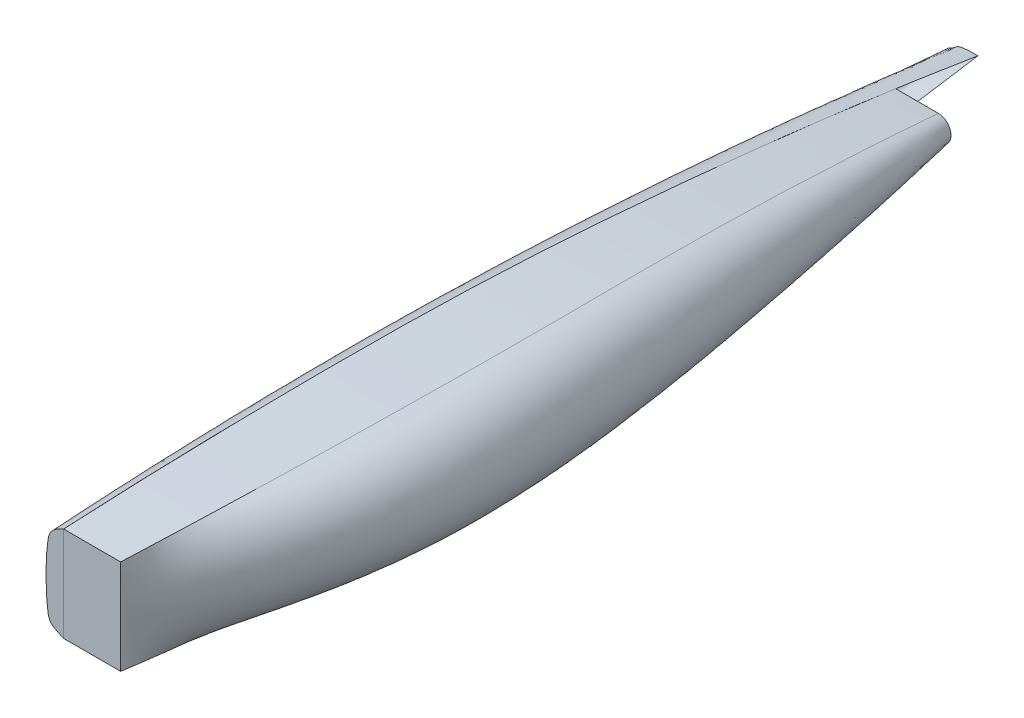
ISO-10303-21;
HEADER;
FILE_DESCRIPTION(('STEP AP214'),'2;1');
FILE_NAME('part.step','',(''),(''),'','','');
FILE_SCHEMA(('AUTOMOTIVE_DESIGN { 1 0 10303 214 1 1 1 1 }'));
ENDSEC;
DATA;
#1=APPLICATION_CONTEXT('core data for automotive mechanical design processes');
#2=APPLICATION_PROTOCOL_DEFINITION('international standard','automotive_design',2000,#1);
#3=PRODUCT_CONTEXT('',#1,'mechanical');
#4=PRODUCT('Part','Part','',(#3));
#5=PRODUCT_RELATED_PRODUCT_CATEGORY('part','',(#4));
#6=PRODUCT_DEFINITION_FORMATION('','',#4);
#7=PRODUCT_DEFINITION_CONTEXT('part definition',#1,'design');
#8=PRODUCT_DEFINITION('design','',#6,#7);
#9=PRODUCT_DEFINITION_SHAPE('','',#8);
#10=(LENGTH_UNIT() NAMED_UNIT(*) SI_UNIT(.MILLI.,.METRE.));
#11=(NAMED_UNIT(*) PLANE_ANGLE_UNIT() SI_UNIT($,.RADIAN.));
#12=(NAMED_UNIT(*) SI_UNIT($,.STERADIAN.) SOLID_ANGLE_UNIT());
#13=UNCERTAINTY_MEASURE_WITH_UNIT(LENGTH_MEASURE(1.E-05),#10,'distance_accuracy_value','');
#14=(GEOMETRIC_REPRESENTATION_CONTEXT(3) GLOBAL_UNCERTAINTY_ASSIGNED_CONTEXT((#13)) GLOBAL_UNIT_ASSIGNED_CONTEXT((#10,
#11,#12)) REPRESENTATION_CONTEXT('',''));
#15=CARTESIAN_POINT('',(0.,0.,0.));
#16=DIRECTION('',(0.,0.,1.));
#17=DIRECTION('',(1.,0.,0.));
#18=AXIS2_PLACEMENT_3D('',#15,#16,#17);
#19=CARTESIAN_POINT('',(1027.92532465034,10497.7473217622,-20718.));
#20=DIRECTION('',(0.,0.,-1.));
#21=DIRECTION('',(-1.,0.,0.));
#22=AXIS2_PLACEMENT_3D('',#19,#20,#21);
#23=PLANE('',#22);
#24=DIRECTION('',(-1.,0.,0.));
#25=VECTOR('',#24,1.);
#26=CARTESIAN_POINT('',(0.,10803.2966765298,-20718.));
#27=LINE('',#26,#25);
#28=CARTESIAN_POINT('',(1027.92532465034,10803.2966765298,-20718.));
#29=VERTEX_POINT('',#28);
#30=CARTESIAN_POINT('',(0.,10803.2966765298,-20718.));
#31=VERTEX_POINT('',#30);
#32=EDGE_CURVE('E252',#29,#31,#27,.T.);
#33=ORIENTED_EDGE('',*,*,#32,.F.);
#34=CARTESIAN_POINT('',(1027.92532465034,10497.7473217622,-20718.));
#35=DIRECTION('',(0.,0.,1.));
#36=DIRECTION('',(-1.,0.,0.));
#37=AXIS2_PLACEMENT_3D('',#34,#35,#36);
#38=CIRCLE('',#37,305.549354767676);
#39=CARTESIAN_POINT('',(1333.47467941801,10497.7473217622,-20718.));
#40=VERTEX_POINT('',#39);
#41=EDGE_CURVE('E369',#40,#29,#38,.T.);
#42=ORIENTED_EDGE('',*,*,#41,.F.);
#43=CARTESIAN_POINT('',(1027.92532465034,10497.7473217622,-20718.));
#44=DIRECTION('',(0.,0.,1.));
#45=DIRECTION('',(1.,0.,0.));
#46=AXIS2_PLACEMENT_3D('',#43,#44,#45);
#47=CIRCLE('',#46,305.549354767676);
#48=CARTESIAN_POINT('',(1027.92532465034,10192.1979669945,-20718.));
#49=VERTEX_POINT('',#48);
#50=EDGE_CURVE('E322',#49,#40,#47,.T.);
#51=ORIENTED_EDGE('',*,*,#50,.F.);
#52=DIRECTION('',(1.,0.,0.));
#53=VECTOR('',#52,1.);
#54=CARTESIAN_POINT('',(1027.92532465034,10192.1979669945,-20718.));
#55=LINE('',#54,#53);
#56=CARTESIAN_POINT('',(0.,10192.1979669945,-20718.));
#57=VERTEX_POINT('',#56);
#58=EDGE_CURVE('E188',#57,#49,#55,.T.);
#59=ORIENTED_EDGE('',*,*,#58,.F.);
#60=DIRECTION('',(0.,-1.,0.));
#61=VECTOR('',#60,1.);
#62=CARTESIAN_POINT('',(0.,10803.2966765298,-20718.));
#63=LINE('',#62,#61);
#64=EDGE_CURVE('E14',#31,#57,#63,.T.);
#65=ORIENTED_EDGE('',*,*,#64,.F.);
#66=EDGE_LOOP('',(#33,#42,#51,#59,#65));
#67=FACE_BOUND('',#66,.T.);
#68=ADVANCED_FACE('F178',(#67),#23,.T.);
#69=CARTESIAN_POINT('',(0.,0.,-678.));
#70=DIRECTION('',(0.,0.,1.));
#71=DIRECTION('',(1.,0.,0.));
#72=AXIS2_PLACEMENT_3D('',#69,#70,#71);
#73=PLANE('',#72);
#74=DIRECTION('',(0.,-1.,0.));
#75=VECTOR('',#74,1.);
#76=CARTESIAN_POINT('',(0.,11639.1820232636,-678.));
#77=LINE('',#76,#75);
#78=CARTESIAN_POINT('',(0.,11639.1820232636,-678.));
#79=VERTEX_POINT('',#78);
#80=CARTESIAN_POINT('',(0.,9356.31262026066,-678.));
#81=VERTEX_POINT('',#80);
#82=EDGE_CURVE('E231',#79,#81,#77,.T.);
#83=ORIENTED_EDGE('',*,*,#82,.T.);
#84=DIRECTION('',(1.,0.,0.));
#85=VECTOR('',#84,1.);
#86=CARTESIAN_POINT('',(0.,9356.31262026066,-678.));
#87=LINE('',#86,#85);
#88=CARTESIAN_POINT('',(1374.83399170481,9356.31262026066,-678.));
#89=VERTEX_POINT('',#88);
#90=EDGE_CURVE('E247',#81,#89,#87,.T.);
#91=ORIENTED_EDGE('',*,*,#90,.T.);
#92=DIRECTION('',(0.,1.,0.));
#93=VECTOR('',#92,1.);
#94=CARTESIAN_POINT('',(1374.83399170481,11639.1820232636,-678.));
#95=LINE('',#94,#93);
#96=CARTESIAN_POINT('',(1374.83399170481,11639.1820232636,-678.));
#97=VERTEX_POINT('',#96);
#98=EDGE_CURVE('E233',#89,#97,#95,.T.);
#99=ORIENTED_EDGE('',*,*,#98,.T.);
#100=DIRECTION('',(-1.,0.,0.));
#101=VECTOR('',#100,1.);
#102=CARTESIAN_POINT('',(0.,11639.1820232636,-678.));
#103=LINE('',#102,#101);
#104=EDGE_CURVE('E226',#97,#79,#103,.T.);
#105=ORIENTED_EDGE('',*,*,#104,.T.);
#106=EDGE_LOOP('',(#83,#91,#99,#105));
#107=FACE_BOUND('',#106,.T.);
#108=ADVANCED_FACE('F229',(#107),#73,.T.);
#109=CARTESIAN_POINT('',(0.,11639.1820232636,-678.));
#110=CARTESIAN_POINT('',(0.,11725.5833342849,-2347.63572045033));
#111=CARTESIAN_POINT('',(0.,11822.034521585,-5648.06900664716));
#112=CARTESIAN_POINT('',(0.,11805.1593895931,-10716.2585665588));
#113=CARTESIAN_POINT('',(0.,11427.4796522117,-15717.5077349829));
#114=CARTESIAN_POINT('',(0.,11040.0066002117,-19051.7296863642));
#115=CARTESIAN_POINT('',(0.,10803.2966765298,-20718.));
#116=CARTESIAN_POINT('',(458.277997234937,11639.1820232636,-678.));
#117=CARTESIAN_POINT('',(511.474520662672,11725.5773457812,-2347.07117194521));
#118=CARTESIAN_POINT('',(579.887470947677,11822.0372946347,-5648.32752959555));
#119=CARTESIAN_POINT('',(590.119579513416,11805.1585547831,-10716.189901836));
#120=CARTESIAN_POINT('',(446.93579945534,11427.4802228301,-15717.5239746352));
#121=CARTESIAN_POINT('',(379.987121435317,11040.0058256561,-19051.7379237504));
#122=CARTESIAN_POINT('',(342.641774883445,10803.2966765298,-20718.));
#123=CARTESIAN_POINT('',(916.555994469874,11639.1820232636,-678.));
#124=CARTESIAN_POINT('',(1022.94904132534,11725.5713572775,-2346.50662344009));
#125=CARTESIAN_POINT('',(1159.77494189535,11822.0400676845,-5648.58605254394));
#126=CARTESIAN_POINT('',(1180.23915902683,11805.1577199731,-10716.1212371132));
#127=CARTESIAN_POINT('',(893.871598910681,11427.4807934486,-15717.5402142875));
#128=CARTESIAN_POINT('',(759.974242870633,11040.0050511005,-19051.7461611366));
#129=CARTESIAN_POINT('',(685.283549766891,10803.2966765298,-20718.));
#130=CARTESIAN_POINT('',(1374.83399170481,11639.1820232636,-678.));
#131=CARTESIAN_POINT('',(1534.42356198802,11725.5653687738,-2345.94207493497));
#132=CARTESIAN_POINT('',(1739.66241284303,11822.0428407342,-5648.84457549232));
#133=CARTESIAN_POINT('',(1770.35873854025,11805.1568851631,-10716.0525723904));
#134=CARTESIAN_POINT('',(1340.80739836602,11427.481364067,-15717.5564539398));
#135=CARTESIAN_POINT('',(1139.96136430595,11040.004276545,-19051.7543985228));
#136=CARTESIAN_POINT('',(1027.92532465034,10803.2966765298,-20718.));
#137=B_SPLINE_SURFACE_WITH_KNOTS('',3,3,((#109,#110,#111,#112,#113,#114,#115),(#116,#117,#118,
#119,#120,#121,#122),(#123,#124,#125,#126,#127,#128,#129),(#130,#131,#132,#133,#134,#135,#136)),
.UNSPECIFIED.,.F.,.F.,.F.,(4,4),(4,1,1,1,4),(0.,1.),(0.,0.251370794558403,0.499752521575732,
0.749308130658367,1.),.UNSPECIFIED.);
#138=CARTESIAN_POINT('',(1374.83399170481,11639.1820232636,-678.));
#139=CARTESIAN_POINT('',(1534.42356198802,11725.5653687738,-2345.94207493497));
#140=CARTESIAN_POINT('',(1739.66241284303,11822.0428407342,-5648.84457549232));
#141=CARTESIAN_POINT('',(1770.35873854025,11805.1568851631,-10716.0525723904));
#142=CARTESIAN_POINT('',(1340.80739836602,11427.481364067,-15717.5564539398));
#143=CARTESIAN_POINT('',(1139.96136430595,11040.004276545,-19051.7543985228));
#144=CARTESIAN_POINT('',(1027.92532465034,10803.2966765298,-20718.));
#145=B_SPLINE_CURVE_WITH_KNOTS('',3,(#138,#139,#140,#141,#142,#143,#144),.UNSPECIFIED.,.F.,.F.,
(4,1,1,1,4),(0.,0.251370794558403,0.499752521575732,0.749308130658367,1.),.UNSPECIFIED.);
#146=EDGE_CURVE('E254',#97,#29,#145,.T.);
#147=CARTESIAN_POINT('',(0.,11639.1820232636,-678.));
#148=CARTESIAN_POINT('',(0.,11725.5833342849,-2347.63572045033));
#149=CARTESIAN_POINT('',(0.,11822.034521585,-5648.06900664716));
#150=CARTESIAN_POINT('',(0.,11805.1593895931,-10716.2585665588));
#151=CARTESIAN_POINT('',(0.,11427.4796522117,-15717.5077349829));
#152=CARTESIAN_POINT('',(0.,11040.0066002117,-19051.7296863642));
#153=CARTESIAN_POINT('',(0.,10803.2966765298,-20718.));
#154=B_SPLINE_CURVE_WITH_KNOTS('',3,(#147,#148,#149,#150,#151,#152,#153),.UNSPECIFIED.,.F.,.F.,
(4,1,1,1,4),(0.,0.251370794558403,0.499752521575732,0.749308130658367,1.),.UNSPECIFIED.);
#155=EDGE_CURVE('E239',#31,#79,#154,.F.);
#156=ORIENTED_EDGE('',*,*,#104,.F.);
#157=ORIENTED_EDGE('',*,*,#146,.T.);
#158=ORIENTED_EDGE('',*,*,#32,.T.);
#159=ORIENTED_EDGE('',*,*,#155,.T.);
#160=EDGE_LOOP('',(#156,#157,#158,#159));
#161=FACE_BOUND('',#160,.T.);
#162=ADVANCED_FACE('F251',(#161),#137,.T.);
#163=CARTESIAN_POINT('',(1374.83399170481,11639.1820232636,-678.));
#164=CARTESIAN_POINT('',(1534.42356198802,11725.5653687738,-2345.94207493497));
#165=CARTESIAN_POINT('',(1739.66241284303,11822.0428407342,-5648.84457549232));
#166=CARTESIAN_POINT('',(1770.35873854025,11805.1568851631,-10716.0525723904));
#167=CARTESIAN_POINT('',(1340.80739836602,11427.481364067,-15717.5564539398));
#168=CARTESIAN_POINT('',(1139.96136430595,11040.004276545,-19051.7543985228));
#169=CARTESIAN_POINT('',(1027.92532465034,10803.2966765298,-20718.));
#170=CARTESIAN_POINT('',(1374.83399170481,11615.4198370557,-678.));
#171=CARTESIAN_POINT('',(1555.5063651766,11712.9275193634,-2345.31174432586));
#172=CARTESIAN_POINT('',(1790.64743054619,11827.4297537224,-5649.13107025804));
#173=CARTESIAN_POINT('',(1811.94334086078,11805.0058499545,-10715.9833568065));
#174=CARTESIAN_POINT('',(1371.55461667482,11427.6777892624,-15717.5467043676));
#175=CARTESIAN_POINT('',(1157.57161316445,11039.645717867,-19051.8239239357));
#176=CARTESIAN_POINT('',(1037.91695982661,10803.2966765298,-20718.));
#177=CARTESIAN_POINT('',(1374.83399170481,11567.9047933216,-678.));
#178=CARTESIAN_POINT('',(1597.67197155377,11687.6611492243,-2344.05108310764));
#179=CARTESIAN_POINT('',(1892.61810621583,11832.1767823288,-5649.70405978951));
#180=CARTESIAN_POINT('',(1895.24738817716,11800.8912903668,-10715.8449256388));
#181=CARTESIAN_POINT('',(1432.98921637071,11424.6563186328,-15717.5272052231));
#182=CARTESIAN_POINT('',(1192.79482775057,11037.945495917,-19051.9629747615));
#183=CARTESIAN_POINT('',(1057.90294704829,10802.3135719356,-20718.));
#184=CARTESIAN_POINT('',(1374.83399170481,11496.6567011027,-678.));
#185=CARTESIAN_POINT('',(1660.20644914958,11641.805299732,-2341.47017133821));
#186=CARTESIAN_POINT('',(2044.11394505894,11825.0401262841,-5650.88009865321));
#187=CARTESIAN_POINT('',(2019.34136547102,11781.9739066164,-10715.551217298));
#188=CARTESIAN_POINT('',(1524.13793136101,11411.5239303809,-15717.525842205));
#189=CARTESIAN_POINT('',(1245.04837826904,11029.6770944891,-19052.1642220255));
#190=CARTESIAN_POINT('',(1087.60128739703,10797.9151281667,-20718.));
#191=CARTESIAN_POINT('',(1374.83399170481,11425.4295696028,-678.000000000001));
#192=CARTESIAN_POINT('',(1721.415277615,11590.22489081,-2338.52352610452));
#193=CARTESIAN_POINT('',(2192.64845315799,11802.8449889206,-5652.22405328567));
#194=CARTESIAN_POINT('',(2141.34188286766,11750.819543001,-10715.2115162796));
#195=CARTESIAN_POINT('',(1613.41505769227,11389.5183860502,-15717.5406485065));
#196=CARTESIAN_POINT('',(1296.25037937464,11016.517952416,-19052.358583389));
#197=CARTESIAN_POINT('',(1116.73019617085,10790.6184244253,-20718.));
#198=CARTESIAN_POINT('',(1374.83399170481,11354.2198861591,-678.000000000001));
#199=CARTESIAN_POINT('',(1780.6805596614,11532.5004331451,-2335.2652009241));
#200=CARTESIAN_POINT('',(2336.75604124993,11766.2168303943,-5653.71121446798));
#201=CARTESIAN_POINT('',(2260.03374764263,11707.6057863438,-10714.832246592));
#202=CARTESIAN_POINT('',(1699.98470208179,11358.9771058378,-15717.5706320868));
#203=CARTESIAN_POINT('',(1345.91300799056,10998.4022703377,-19052.5440522966));
#204=CARTESIAN_POINT('',(1145.01105194866,10780.5067590778,-20718.));
#205=CARTESIAN_POINT('',(1374.83399170481,11283.0241381085,-678.));
#206=CARTESIAN_POINT('',(1837.41552397056,11469.0059361791,-2331.82046853739));
#207=CARTESIAN_POINT('',(2475.00662065364,11715.5857885833,-5655.28417781567));
#208=CARTESIAN_POINT('',(2374.23727251961,11652.7497303439,-10714.4287778391));
#209=CARTESIAN_POINT('',(1783.03483623601,11320.1789223829,-15717.6116917435));
#210=CARTESIAN_POINT('',(1393.56748168005,10975.5519358669,-19052.7198776411));
#211=CARTESIAN_POINT('',(1172.16523330936,10767.6634304906,-20718.));
#212=CARTESIAN_POINT('',(1374.83399170481,11211.8388416028,-678.));
#213=CARTESIAN_POINT('',(1891.06215668368,11399.9811326077,-2328.29184767801));
#214=CARTESIAN_POINT('',(2606.02508853474,11651.615100777,-5656.89599606479));
#215=CARTESIAN_POINT('',(2482.81867232475,11586.7520663104,-10714.0135825862));
#216=CARTESIAN_POINT('',(1861.78521815859,11273.5106354442,-15717.660865538));
#217=CARTESIAN_POINT('',(1438.76750768037,10948.1772664776,-19052.8845915014));
#218=CARTESIAN_POINT('',(1197.93580592775,10752.2244753757,-20718.));
#219=CARTESIAN_POINT('',(1374.83399170481,11140.6605127936,-677.999999999999));
#220=CARTESIAN_POINT('',(1941.09863680321,11325.7749471399,-2324.78204382135));
#221=CARTESIAN_POINT('',(2728.50558898105,11575.0803543461,-5658.49960686901));
#222=CARTESIAN_POINT('',(2584.70000701957,11510.2305497593,-10713.5992584874));
#223=CARTESIAN_POINT('',(1935.49862656835,11219.4270079878,-15717.7148030253));
#224=CARTESIAN_POINT('',(1481.08380488751,10916.5361098938,-19053.0375522281));
#225=CARTESIAN_POINT('',(1222.0658354786,10734.3259304454,-20718.));
#226=CARTESIAN_POINT('',(1374.83399170481,11069.4856678327,-677.999999999999));
#227=CARTESIAN_POINT('',(1987.04338479132,11246.7743011999,-2321.38586081325));
#228=CARTESIAN_POINT('',(2841.22572051731,11486.8919389192,-5660.05159419004));
#229=CARTESIAN_POINT('',(2678.87120459727,11423.9055214271,-10713.1973454507));
#230=CARTESIAN_POINT('',(2003.48094715833,11158.4479786439,-15717.7707429088));
#231=CARTESIAN_POINT('',(1520.12206268116,10880.9331424137,-19053.1774505195));
#232=CARTESIAN_POINT('',(1244.3302389509,10714.1522360627,-20718.));
#233=CARTESIAN_POINT('',(1374.83399170481,10998.3108228718,-677.999999999999));
#234=CARTESIAN_POINT('',(2028.45924723225,11163.4168745887,-2318.19071922851));
#235=CARTESIAN_POINT('',(2943.06063282342,11388.0786645123,-5661.51189705526));
#236=CARTESIAN_POINT('',(2764.39764234037,11328.592980438,-10712.8185752103));
#237=CARTESIAN_POINT('',(2065.09526594969,11091.1614581385,-15717.8258000724));
#238=CARTESIAN_POINT('',(1555.5094546309,10841.6999205558,-19053.3038122553));
#239=CARTESIAN_POINT('',(1264.50393333363,10691.8878325904,-20718.));
#240=CARTESIAN_POINT('',(1374.83399170481,10927.1324940626,-678.));
#241=CARTESIAN_POINT('',(2064.95685212416,11076.1809651207,-2315.27515920387));
#242=CARTESIAN_POINT('',(3032.99483910447,11279.7785982552,-5662.8445507058));
#243=CARTESIAN_POINT('',(2840.43142305215,11225.1983125715,-10712.4724968817));
#244=CARTESIAN_POINT('',(2119.75860126827,11018.2090926881,-15717.8777284926));
#245=CARTESIAN_POINT('',(1586.91737543965,10799.2115335827,-19053.4154628005));
#246=CARTESIAN_POINT('',(1282.40247826389,10667.7578030396,-20717.9999999999));
#247=CARTESIAN_POINT('',(1374.83399170481,10855.9471975568,-678.));
#248=CARTESIAN_POINT('',(2096.1975797994,10985.5811838496,-2312.70813695908));
#249=CARTESIAN_POINT('',(3110.13436566145,11163.2273371652,-5664.01795318928));
#250=CARTESIAN_POINT('',(2906.21691566348,11114.7053009613,-10712.1675837417));
#251=CARTESIAN_POINT('',(2166.95715498021,10940.2892793104,-15717.9242216531));
#252=CARTESIAN_POINT('',(1614.04296687618,10753.8643243641,-19053.5120947625));
#253=CARTESIAN_POINT('',(1297.84143337877,10641.9872304212,-20718.));
#254=CARTESIAN_POINT('',(1374.83399170481,10784.7514495063,-678.));
#255=CARTESIAN_POINT('',(2121.89560743488,10892.1626488499,-2310.54838140521));
#256=CARTESIAN_POINT('',(3173.71571935787,11039.7443715354,-5665.00521808625));
#257=CARTESIAN_POINT('',(2961.1007093333,10998.1686394919,-10711.9109538062));
#258=CARTESIAN_POINT('',(2206.23995710547,10858.1430753177,-15717.9636838987));
#259=CARTESIAN_POINT('',(1636.63543590475,10706.0893560267,-19053.5926484268));
#260=CARTESIAN_POINT('',(1310.68476196604,10614.8330490605,-20718.));
#261=CARTESIAN_POINT('',(1374.83399170481,10713.5417660625,-678.));
#262=CARTESIAN_POINT('',(2141.82061836382,10796.4945507034,-2308.8438381757));
#263=CARTESIAN_POINT('',(3223.11524906046,10910.7197382683,-5665.78437135567));
#264=CARTESIAN_POINT('',(3004.53515750063,10876.7017982484,-10711.7085021651));
#265=CARTESIAN_POINT('',(2237.23493184485,10772.5544811161,-15717.9944981209));
#266=CARTESIAN_POINT('',(1654.47308006722,10656.3337112549,-19053.6569390026));
#267=CARTESIAN_POINT('',(1320.79642731349,10586.5521932827,-20718.));
#268=CARTESIAN_POINT('',(1374.83399170481,10642.3146345627,-678.));
#269=CARTESIAN_POINT('',(2155.79611098434,10699.1672201778,-2307.6316316041));
#270=CARTESIAN_POINT('',(3257.85547420781,10777.5974093699,-5666.33842393505));
#271=CARTESIAN_POINT('',(3036.08605619724,10751.4681999409,-10711.5647052658));
#272=CARTESIAN_POINT('',(2259.63964850897,10684.3376120662,-15718.0157419857));
#273=CARTESIAN_POINT('',(1667.39196466383,10605.06898509,-19053.7041098203));
#274=CARTESIAN_POINT('',(1328.09313105484,10557.4232845088,-20718.));
#275=CARTESIAN_POINT('',(1374.83399170481,10571.0665423437,-678.));
#276=CARTESIAN_POINT('',(2163.71103878589,10600.7756862247,-2306.93675971091));
#277=CARTESIAN_POINT('',(3277.60787009853,10641.8646470388,-5666.65592468513));
#278=CARTESIAN_POINT('',(3055.43552591962,10623.6672862932,-10711.4826168173));
#279=CARTESIAN_POINT('',(2273.2385312031,10594.3347499461,-15718.0266467899));
#280=CARTESIAN_POINT('',(1675.25772200082,10552.7762607025,-19053.7339034885));
#281=CARTESIAN_POINT('',(1332.49157482377,10527.7249441601,-20718.));
#282=CARTESIAN_POINT('',(1374.83399170481,10523.5514986096,-678.));
#283=CARTESIAN_POINT('',(2164.89106688402,10534.8943161025,-2306.82952741294));
#284=CARTESIAN_POINT('',(3280.67557300233,10550.6334386625,-5666.70478658267));
#285=CARTESIAN_POINT('',(3060.06734386239,10537.5753392411,-10711.4704152379));
#286=CARTESIAN_POINT('',(2276.33703694174,10533.7131896834,-15718.0265846194));
#287=CARTESIAN_POINT('',(1677.09001975028,10517.5606823981,-19053.7422769408));
#288=CARTESIAN_POINT('',(1333.47467941801,10507.7389569384,-20718.));
#289=CARTESIAN_POINT('',(1374.83399170481,10475.9917193804,-678.));
#290=CARTESIAN_POINT('',(2164.53832457373,10468.9897033437,-2306.86432257757));
#291=CARTESIAN_POINT('',(3279.83015687046,10459.4734843724,-5666.68849257141));
#292=CARTESIAN_POINT('',(3059.67084667444,10451.3875739791,-10711.4758948283));
#293=CARTESIAN_POINT('',(2276.66400384383,10473.0279529258,-15718.020914871));
#294=CARTESIAN_POINT('',(1677.25310652157,10482.3044751162,-19053.7518713776));
#295=CARTESIAN_POINT('',(1333.47467941801,10487.7407985634,-20718.));
#296=CARTESIAN_POINT('',(1374.83399170481,10428.3872334506,-678.));
#297=CARTESIAN_POINT('',(2162.6482414301,10403.0619815714,-2307.04156869852));
#298=CARTESIAN_POINT('',(3275.18928865264,10368.2486511975,-5666.60684837192));
#299=CARTESIAN_POINT('',(3054.32968149873,10365.1962429609,-10711.4991083074));
#300=CARTESIAN_POINT('',(2274.18258785295,10412.2526095904,-15718.0096208338));
#301=CARTESIAN_POINT('',(1675.74208588698,10447.0078276285,-19053.7626904191));
#302=CARTESIAN_POINT('',(1332.48872494526,10467.7307088005,-20718.));
#303=CARTESIAN_POINT('',(1374.83399170481,10356.9560779648,-678.));
#304=CARTESIAN_POINT('',(2153.86531632334,10304.7406544002,-2307.82188341661));
#305=CARTESIAN_POINT('',(3253.42924763214,10232.9084013399,-5666.24943258456));
#306=CARTESIAN_POINT('',(3034.1754432792,10237.2596709348,-10711.5943184531));
#307=CARTESIAN_POINT('',(2261.38470865872,10321.8674955031,-15717.986043241));
#308=CARTESIAN_POINT('',(1668.27819235623,10394.5247288733,-19053.7537525284));
#309=CARTESIAN_POINT('',(1328.08168744358,10438.0115660437,-20718.));
#310=CARTESIAN_POINT('',(1374.83399170481,10285.5039689585,-678.));
#311=CARTESIAN_POINT('',(2139.19613505478,10207.5813846978,-2309.10247656965));
#312=CARTESIAN_POINT('',(3217.11157432563,10100.4563390352,-5665.66351336307));
#313=CARTESIAN_POINT('',(3002.06265721968,10111.8607225407,-10711.7483389947));
#314=CARTESIAN_POINT('',(2239.6275050308,10233.1526534566,-15717.9556992944));
#315=CARTESIAN_POINT('',(1655.68528013344,10343.0186524377,-19053.7210175692));
#316=CARTESIAN_POINT('',(1320.77630177508,10408.8755371587,-20718.));
#317=CARTESIAN_POINT('',(1374.83399170481,10214.0343795022,-678.));
#318=CARTESIAN_POINT('',(2118.77964286028,10112.1343162459,-2310.85573361262));
#319=CARTESIAN_POINT('',(3166.59368644769,9972.26785917303,-5664.86176801204));
#320=CARTESIAN_POINT('',(2958.29349388467,9990.15839336817,-10711.9577010903));
#321=CARTESIAN_POINT('',(2209.11200959566,10146.9892975625,-15717.9197955749));
#322=CARTESIAN_POINT('',(1638.08748495354,10292.9892969621,-19053.6639965144));
#323=CARTESIAN_POINT('',(1310.65830395917,10380.5983743024,-20717.9999999999));
#324=CARTESIAN_POINT('',(1374.83399170481,10142.5507826665,-678.));
#325=CARTESIAN_POINT('',(2092.79427533251,10018.9435812016,-2313.04446007752));
#326=CARTESIAN_POINT('',(3102.36601060267,9849.67221495099,-5663.86121408628));
#327=CARTESIAN_POINT('',(2903.28085282506,9873.27870196437,-10712.2179323103));
#328=CARTESIAN_POINT('',(2170.13276597318,10064.2318585231,-15717.8792094693));
#329=CARTESIAN_POINT('',(1615.64748967727,10244.9275785838,-19053.5836486775));
#330=CARTESIAN_POINT('',(1297.81343001527,10353.4558296317,-20718.));
#331=CARTESIAN_POINT('',(1374.83399170481,10071.0566802962,-678.));
#332=CARTESIAN_POINT('',(2061.46683137475,9928.53270316375,-2315.62112493707));
#333=CARTESIAN_POINT('',(3025.0403735565,9733.94624535447,-5662.68362992937));
#334=CARTESIAN_POINT('',(2837.54757484213,9762.30095156074,-10712.5232082051));
#335=CARTESIAN_POINT('',(2123.06303417552,9985.70448565833,-15717.8354705207));
#336=CARTESIAN_POINT('',(1588.58774691196,10199.2996693495,-19053.4803164608));
#337=CARTESIAN_POINT('',(1282.37822691317,10327.7017388384,-20718.0000000001));
#338=CARTESIAN_POINT('',(1374.83399170481,9999.55557423611,-678.));
#339=CARTESIAN_POINT('',(2025.06894993432,9841.40338623894,-2318.52841104384));
#340=CARTESIAN_POINT('',(2935.3468503159,9626.30175124174,-5661.35524127345));
#341=CARTESIAN_POINT('',(2761.7187305882,9658.24912251768,-10712.8666316338));
#342=CARTESIAN_POINT('',(2068.36279759699,9912.1866992483,-15717.7899497691));
#343=CARTESIAN_POINT('',(1557.16425286909,10156.5548497843,-19053.3554371199));
#344=CARTESIAN_POINT('',(1264.48924162266,10303.5899376142,-20718.));
#345=CARTESIAN_POINT('',(1374.83399170481,9928.05096633118,-678.));
#346=CARTESIAN_POINT('',(1983.91644805528,9758.03078017828,-2321.6995506805));
#347=CARTESIAN_POINT('',(2834.12532884579,9527.87604641181,-5659.90662605989));
#348=CARTESIAN_POINT('',(2676.51844227665,9562.07993815694,-10713.2400710988));
#349=CARTESIAN_POINT('',(2006.56271498433,9844.41210147774,-15717.7446078627));
#350=CARTESIAN_POINT('',(1521.68793833535,10117.1063524726,-19053.2098982627));
#351=CARTESIAN_POINT('',(1244.32967022422,10281.3429761882,-20717.9999999999));
#352=CARTESIAN_POINT('',(1374.83399170481,9856.54635842626,-678.));
#353=CARTESIAN_POINT('',(1938.36771372871,9678.85924325617,-2325.05890390512));
#354=CARTESIAN_POINT('',(2722.31879155993,9439.72184409167,-5658.37239349918));
#355=CARTESIAN_POINT('',(2582.76030774481,9474.67550280989,-10713.6344253259));
#356=CARTESIAN_POINT('',(1938.26928120503,9783.05312198045,-15717.7012515006));
#357=CARTESIAN_POINT('',(1482.49896996859,10081.3438690724,-19053.0456022815));
#358=CARTESIAN_POINT('',(1222.08270879831,10261.1834047898,-20718.));
#359=CARTESIAN_POINT('',(1374.83399170481,9785.0452523662,-678.));
#360=CARTESIAN_POINT('',(1888.82186441545,9604.29942520697,-2328.52251902384));
#361=CARTESIAN_POINT('',(2600.96385913356,9362.79865287604,-5656.79098201495));
#362=CARTESIAN_POINT('',(2481.34208209199,9396.83253522317,-10714.0395023859));
#363=CARTESIAN_POINT('',(1864.1489155086,9728.72257335715,-15717.662224806));
#364=CARTESIAN_POINT('',(1439.98407122785,10049.6113263609,-19052.8639273343));
#365=CARTESIAN_POINT('',(1197.97090757412,10243.2944194993,-20718.0000000001));
#366=CARTESIAN_POINT('',(1374.83399170481,9713.55114999587,-678.));
#367=CARTESIAN_POINT('',(1835.71684061838,9534.71947961438,-2331.99945779491));
#368=CARTESIAN_POINT('',(2471.1820713515,9297.96621609538,-5655.20399967217));
#369=CARTESIAN_POINT('',(2373.23477096256,9329.25618166849,-10714.4443634212));
#370=CARTESIAN_POINT('',(1784.92980201724,9681.95875333328,-15717.6296880425));
#371=CARTESIAN_POINT('',(1394.55379126025,10022.2223438194,-19052.6671862001));
#372=CARTESIAN_POINT('',(1172.21681678082,10227.8592163972,-20718.));
#373=CARTESIAN_POINT('',(1374.83399170481,9642.06755316014,-678.));
#374=CARTESIAN_POINT('',(1779.52603509125,9470.45836238011,-2335.39112946452));
#375=CARTESIAN_POINT('',(2334.16965166205,9245.9703467429,-5653.65658209859));
#376=CARTESIAN_POINT('',(2259.47523749167,9272.55330409567,-10714.8370582904));
#377=CARTESIAN_POINT('',(1701.38654408611,9643.22703245917,-15717.6063229719));
#378=CARTESIAN_POINT('',(1346.65530310061,9999.44089940219,-19052.4571512334));
#379=CARTESIAN_POINT('',(1145.07427211013,10215.0143424533,-20718.));
#380=CARTESIAN_POINT('',(1374.83399170481,9570.59796370387,-678.));
#381=CARTESIAN_POINT('',(1720.75843303245,9411.75710685938,-2338.59901589109));
#382=CARTESIAN_POINT('',(2191.18610179261,9207.46613289852,-5652.19380158924));
#383=CARTESIAN_POINT('',(2141.15467940281,9227.21821931298,-10715.2057498359));
#384=CARTESIAN_POINT('',(1614.33887434621,9612.91710039719,-15717.5944194809));
#385=CARTESIAN_POINT('',(1296.75302377237,9981.47894800938,-19052.2364371252));
#386=CARTESIAN_POINT('',(1116.79710925379,10204.8963446374,-20718.));
#387=CARTESIAN_POINT('',(1374.83399170481,9499.14585469759,-678.));
#388=CARTESIAN_POINT('',(1659.94353731705,9358.99635057983,-2341.50208733917));
#389=CARTESIAN_POINT('',(2043.54810534301,9182.90070587845,-5650.87107058217));
#390=CARTESIAN_POINT('',(2019.40827220688,9193.66587679632,-10715.5357540157));
#391=CARTESIAN_POINT('',(1524.63755883371,9591.30161854356,-15717.5973223931));
#392=CARTESIAN_POINT('',(1245.337091936,9968.55821688394,-19052.0071055851));
#393=CARTESIAN_POINT('',(1087.66108036876,10197.5909589689,-20718.));
#394=CARTESIAN_POINT('',(1374.83399170481,9427.71469921181,-678.));
#395=CARTESIAN_POINT('',(1597.67070723936,9311.79253887342,-2344.04839349478));
#396=CARTESIAN_POINT('',(1892.59882714644,9172.93130739127,-5649.71210307587));
#397=CARTESIAN_POINT('',(1895.40770715871,9172.07813346017,-10715.8210137835));
#398=CARTESIAN_POINT('',(1433.15996995465,9578.70553629914,-15717.6155472587));
#399=CARTESIAN_POINT('',(1192.9053912071,9960.60292217507,-19051.772032573));
#400=CARTESIAN_POINT('',(1057.94193761204,10193.1839214672,-20718.));
#401=CARTESIAN_POINT('',(1374.83399170481,9380.11021328198,-678.));
#402=CARTESIAN_POINT('',(1555.5055073281,9285.49996029393,-2345.29715317246));
#403=CARTESIAN_POINT('',(1790.71288073863,9175.53844039376,-5649.14528914859));
#404=CARTESIAN_POINT('',(1812.02415625465,9166.00386039537,-10715.9554852464));
#405=CARTESIAN_POINT('',(1371.58548958371,9576.12058462689,-15717.64479035));
#406=CARTESIAN_POINT('',(1157.62016351949,9959.16615417609,-19051.6128128451));
#407=CARTESIAN_POINT('',(1037.93184784909,10192.1979669945,-20718.));
#408=CARTESIAN_POINT('',(1374.83399170481,9356.31262026066,-678.));
#409=CARTESIAN_POINT('',(1534.42290737246,9272.35832094777,-2345.9215330113));
#410=CARTESIAN_POINT('',(1739.66218840214,9179.79088788089,-5648.86188218494));
#411=CARTESIAN_POINT('',(1770.36047394811,9164.83329025006,-10716.0227209779));
#412=CARTESIAN_POINT('',(1340.80062454656,9576.55351040013,-15717.6594118956));
#413=CARTESIAN_POINT('',(1139.9760713584,9958.94074741299,-19051.5332029812));
#414=CARTESIAN_POINT('',(1027.92532465034,10192.1979669945,-20718.));
#415=B_SPLINE_SURFACE_WITH_KNOTS('',3,3,((#163,#164,#165,#166,#167,#168,#169),(#170,#171,#172,
#173,#174,#175,#176),(#177,#178,#179,#180,#181,#182,#183),(#184,#185,#186,#187,#188,#189,#190),
(#191,#192,#193,#194,#195,#196,#197),(#198,#199,#200,#201,#202,#203,#204),(#205,#206,#207,#208,
#209,#210,#211),(#212,#213,#214,#215,#216,#217,#218),(#219,#220,#221,#222,#223,#224,#225),(#226,
#227,#228,#229,#230,#231,#232),(#233,#234,#235,#236,#237,#238,#239),(#240,#241,#242,#243,#244,
#245,#246),(#247,#248,#249,#250,#251,#252,#253),(#254,#255,#256,#257,#258,#259,#260),(#261,#262,
#263,#264,#265,#266,#267),(#268,#269,#270,#271,#272,#273,#274),(#275,#276,#277,#278,#279,#280,
#281),(#282,#283,#284,#285,#286,#287,#288),(#289,#290,#291,#292,#293,#294,#295),(#296,#297,#298,
#299,#300,#301,#302),(#303,#304,#305,#306,#307,#308,#309),(#310,#311,#312,#313,#314,#315,#316),
(#317,#318,#319,#320,#321,#322,#323),(#324,#325,#326,#327,#328,#329,#330),(#331,#332,#333,#334,
#335,#336,#337),(#338,#339,#340,#341,#342,#343,#344),(#345,#346,#347,#348,#349,#350,#351),(#352,
#353,#354,#355,#356,#357,#358),(#359,#360,#361,#362,#363,#364,#365),(#366,#367,#368,#369,#370,
#371,#372),(#373,#374,#375,#376,#377,#378,#379),(#380,#381,#382,#383,#384,#385,#386),(#387,#388,
#389,#390,#391,#392,#393),(#394,#395,#396,#397,#398,#399,#400),(#401,#402,#403,#404,#405,#406,
#407),(#408,#409,#410,#411,#412,#413,#414)),.UNSPECIFIED.,.F.,.F.,.F.,(4,1,1,1,1,1,1,1,1,1,1,1,
1,1,1,1,2,1,1,1,1,1,1,1,1,1,1,1,1,1,1,1,4),(4,1,1,1,4),(0.,0.0312267353226366,
0.0624534706452732,0.0936802059679098,0.124906941290546,0.156133676613183,0.18736041193582,
0.218587147258456,0.249813882581093,0.281040617903729,0.312267353226366,0.343494088549002,
0.374720823871639,0.405947559194276,0.437174294516912,0.468401029839549,0.499627765162185,
0.530901029839549,0.562174294516912,0.593447559194276,0.624720823871639,0.655994088549002,
0.687267353226366,0.718540617903729,0.749813882581093,0.781087147258456,0.812360411935819,
0.843633676613183,0.874906941290546,0.90618020596791,0.937453470645273,0.968726735322637,1.),
(0.,0.251370794558403,0.499752521575732,0.749308130658367,1.),.UNSPECIFIED.);
#416=CARTESIAN_POINT('',(1374.83399170481,9356.31262026066,-678.));
#417=CARTESIAN_POINT('',(1534.42290737246,9272.35832094777,-2345.9215330113));
#418=CARTESIAN_POINT('',(1739.66218840214,9179.79088788089,-5648.86188218494));
#419=CARTESIAN_POINT('',(1770.36047394811,9164.83329025006,-10716.0227209779));
#420=CARTESIAN_POINT('',(1340.80062454656,9576.55351040013,-15717.6594118956));
#421=CARTESIAN_POINT('',(1139.9760713584,9958.94074741299,-19051.5332029812));
#422=CARTESIAN_POINT('',(1027.92532465034,10192.1979669945,-20718.));
#423=B_SPLINE_CURVE_WITH_KNOTS('',3,(#416,#417,#418,#419,#420,#421,#422),.UNSPECIFIED.,.F.,.F.,
(4,1,1,1,4),(0.,0.251370794558403,0.499752521575732,0.749308130658367,1.),.UNSPECIFIED.);
#424=EDGE_CURVE('E256',#89,#49,#423,.T.);
#425=ORIENTED_EDGE('',*,*,#98,.F.);
#426=ORIENTED_EDGE('',*,*,#424,.T.);
#427=ORIENTED_EDGE('',*,*,#50,.T.);
#428=ORIENTED_EDGE('',*,*,#41,.T.);
#429=ORIENTED_EDGE('',*,*,#146,.F.);
#430=EDGE_LOOP('',(#425,#426,#427,#428,#429));
#431=FACE_BOUND('',#430,.T.);
#432=ADVANCED_FACE('F286',(#431),#415,.T.);
#433=CARTESIAN_POINT('',(0.,9356.31262026066,-678.));
#434=DIRECTION('',(-1.,0.,0.));
#435=DIRECTION('',(0.,1.,0.));
#436=AXIS2_PLACEMENT_3D('',#433,#434,#435);
#437=PLANE('',#436);
#438=ORIENTED_EDGE('',*,*,#82,.F.);
#439=ORIENTED_EDGE('',*,*,#155,.F.);
#440=ORIENTED_EDGE('',*,*,#64,.T.);
#441=CARTESIAN_POINT('',(0.,9356.31262026066,-678.));
#442=CARTESIAN_POINT('',(0.,9272.33789620447,-2347.6151019107));
#443=CARTESIAN_POINT('',(0.,9179.80033902018,-5648.08638278545));
#444=CARTESIAN_POINT('',(0.,9164.83046649866,-10716.2285868555));
#445=CARTESIAN_POINT('',(0.,9576.55536863459,-15717.6111403902));
#446=CARTESIAN_POINT('',(0.,9958.93829596956,-19051.5075285423));
#447=CARTESIAN_POINT('',(0.,10192.1979669945,-20718.));
#448=B_SPLINE_CURVE_WITH_KNOTS('',3,(#441,#442,#443,#444,#445,#446,#447),.UNSPECIFIED.,.F.,.F.,
(4,1,1,1,4),(0.,0.251370794558403,0.499752521575732,0.749308130658367,1.),.UNSPECIFIED.);
#449=EDGE_CURVE('E196',#81,#57,#448,.T.);
#450=ORIENTED_EDGE('',*,*,#449,.F.);
#451=EDGE_LOOP('',(#438,#439,#440,#450));
#452=FACE_BOUND('',#451,.T.);
#453=ADVANCED_FACE('F246',(#452),#437,.T.);
#454=CARTESIAN_POINT('',(1374.83399170481,9356.31262026066,-678.));
#455=CARTESIAN_POINT('',(1534.42290737246,9272.35832094777,-2345.9215330113));
#456=CARTESIAN_POINT('',(1739.66218840214,9179.79088788089,-5648.86188218494));
#457=CARTESIAN_POINT('',(1770.36047394811,9164.83329025006,-10716.0227209779));
#458=CARTESIAN_POINT('',(1340.80062454656,9576.55351040013,-15717.6594118956));
#459=CARTESIAN_POINT('',(1139.9760713584,9958.94074741299,-19051.5332029812));
#460=CARTESIAN_POINT('',(1027.92532465034,10192.1979669945,-20718.));
#461=CARTESIAN_POINT('',(916.555994469874,9356.31262026066,-678.));
#462=CARTESIAN_POINT('',(1022.94860491498,9272.3515127,-2346.48605597776));
#463=CARTESIAN_POINT('',(1159.77479226809,9179.79403826065,-5648.60338238511));
#464=CARTESIAN_POINT('',(1180.24031596541,9164.83234899959,-10716.0913429371));
#465=CARTESIAN_POINT('',(893.867083031043,9576.55412981161,-15717.6433213938));
#466=CARTESIAN_POINT('',(759.984047572269,9958.93993026518,-19051.5246448349));
#467=CARTESIAN_POINT('',(685.283549766891,10192.1979669945,-20718.));
#468=CARTESIAN_POINT('',(458.277997234937,9356.31262026066,-678.));
#469=CARTESIAN_POINT('',(511.474302457488,9272.34470445224,-2347.05057894423));
#470=CARTESIAN_POINT('',(579.887396134046,9179.79718864041,-5648.34488258528));
#471=CARTESIAN_POINT('',(590.120157982704,9164.83140774913,-10716.1599648963));
#472=CARTESIAN_POINT('',(446.933541515522,9576.5547492231,-15717.627230892));
#473=CARTESIAN_POINT('',(379.992023786135,9958.93911311737,-19051.5160866886));
#474=CARTESIAN_POINT('',(342.641774883445,10192.1979669945,-20718.));
#475=CARTESIAN_POINT('',(0.,9356.31262026066,-678.));
#476=CARTESIAN_POINT('',(0.,9272.33789620447,-2347.6151019107));
#477=CARTESIAN_POINT('',(0.,9179.80033902018,-5648.08638278545));
#478=CARTESIAN_POINT('',(0.,9164.83046649866,-10716.2285868555));
#479=CARTESIAN_POINT('',(0.,9576.55536863459,-15717.6111403902));
#480=CARTESIAN_POINT('',(0.,9958.93829596956,-19051.5075285423));
#481=CARTESIAN_POINT('',(0.,10192.1979669945,-20718.));
#482=B_SPLINE_SURFACE_WITH_KNOTS('',3,3,((#454,#455,#456,#457,#458,#459,#460),(#461,#462,#463,
#464,#465,#466,#467),(#468,#469,#470,#471,#472,#473,#474),(#475,#476,#477,#478,#479,#480,#481)),
.UNSPECIFIED.,.F.,.F.,.F.,(4,4),(4,1,1,1,4),(0.,1.),(0.,0.251370794558403,0.499752521575732,
0.749308130658367,1.),.UNSPECIFIED.);
#483=ORIENTED_EDGE('',*,*,#90,.F.);
#484=ORIENTED_EDGE('',*,*,#449,.T.);
#485=ORIENTED_EDGE('',*,*,#58,.T.);
#486=ORIENTED_EDGE('',*,*,#424,.F.);
#487=EDGE_LOOP('',(#483,#484,#485,#486));
#488=FACE_BOUND('',#487,.T.);
#489=ADVANCED_FACE('F337',(#488),#482,.T.);
#490=CLOSED_SHELL('',(#68,#108,#162,#432,#453,#489));
#491=MANIFOLD_SOLID_BREP('B2',#490);
#492=CARTESIAN_POINT('',(0.,0.,-677.));
#493=DIRECTION('',(1.,0.,0.));
#494=DIRECTION('',(0.,0.,-1.));
#495=AXIS2_PLACEMENT_3D('',#492,#493,#494);
#496=PLANE('',#495);
#497=DIRECTION('',(0.,-1.,0.));
#498=VECTOR('',#497,1.);
#499=CARTESIAN_POINT('',(0.,0.,-678.));
#500=LINE('',#499,#498);
#501=CARTESIAN_POINT('',(0.,11639.1820232636,-678.));
#502=VERTEX_POINT('',#501);
#503=CARTESIAN_POINT('',(0.,9356.31262026066,-678.));
#504=VERTEX_POINT('',#503);
#505=EDGE_CURVE('E614',#502,#504,#500,.T.);
#506=ORIENTED_EDGE('',*,*,#505,.F.);
#507=DIRECTION('',(0.,0.,-1.));
#508=VECTOR('',#507,1.);
#509=CARTESIAN_POINT('',(0.,11639.1820232636,-677.));
#510=LINE('',#509,#508);
#511=CARTESIAN_POINT('',(0.,11639.1820232636,-677.));
#512=VERTEX_POINT('',#511);
#513=EDGE_CURVE('E176',#512,#502,#510,.T.);
#514=ORIENTED_EDGE('',*,*,#513,.F.);
#515=DIRECTION('',(0.,-1.,0.));
#516=VECTOR('',#515,1.);
#517=CARTESIAN_POINT('',(0.,0.,-677.));
#518=LINE('',#517,#516);
#519=CARTESIAN_POINT('',(0.,9356.31262026066,-677.));
#520=VERTEX_POINT('',#519);
#521=EDGE_CURVE('E612',#512,#520,#518,.T.);
#522=ORIENTED_EDGE('',*,*,#521,.T.);
#523=DIRECTION('',(0.,0.,-1.));
#524=VECTOR('',#523,1.);
#525=CARTESIAN_POINT('',(0.,9356.31262026066,-677.));
#526=LINE('',#525,#524);
#527=EDGE_CURVE('E594',#520,#504,#526,.T.);
#528=ORIENTED_EDGE('',*,*,#527,.T.);
#529=EDGE_LOOP('',(#506,#514,#522,#528));
#530=FACE_BOUND('',#529,.T.);
#531=ADVANCED_FACE('F578',(#530),#496,.T.);
#532=CARTESIAN_POINT('',(0.,11639.1820232636,-677.));
#533=CARTESIAN_POINT('',(-219.916998247005,11546.5380094758,-677.));
#534=CARTESIAN_POINT('',(-347.686284454112,11419.016148569,-677.));
#535=CARTESIAN_POINT('',(-412.183717144127,10959.4894128098,-677.));
#536=CARTESIAN_POINT('',(-422.766788773146,10764.9581766083,-677.));
#537=CARTESIAN_POINT('',(-422.766788773146,10497.7473217622,-677.));
#538=B_SPLINE_CURVE_WITH_KNOTS('',3,(#532,#533,#534,#535,#536,#537),.UNSPECIFIED.,.F.,.F.,(4,1,
1,4),(0.,0.327655427438451,0.427655427438451,1.),.UNSPECIFIED.);
#539=DIRECTION('',(0.,0.,-1.));
#540=VECTOR('',#539,1.);
#541=SURFACE_OF_LINEAR_EXTRUSION('',#538,#540);
#542=CARTESIAN_POINT('',(0.,11639.1820232636,-678.));
#543=CARTESIAN_POINT('',(-219.916998247005,11546.5380094758,-678.));
#544=CARTESIAN_POINT('',(-347.686284454112,11419.016148569,-678.));
#545=CARTESIAN_POINT('',(-412.183717144127,10959.4894128098,-678.));
#546=CARTESIAN_POINT('',(-422.766788773146,10764.9581766083,-678.));
#547=CARTESIAN_POINT('',(-422.766788773146,10497.7473217622,-678.));
#548=B_SPLINE_CURVE_WITH_KNOTS('',3,(#542,#543,#544,#545,#546,#547),.UNSPECIFIED.,.F.,.F.,(4,1,
1,4),(0.,0.327655427438451,0.427655427438451,1.),.UNSPECIFIED.);
#549=CARTESIAN_POINT('',(-422.766788773146,10497.7473217622,-678.));
#550=VERTEX_POINT('',#549);
#551=EDGE_CURVE('E626',#502,#550,#548,.T.);
#552=ORIENTED_EDGE('',*,*,#551,.T.);
#553=DIRECTION('',(0.,0.,-1.));
#554=VECTOR('',#553,1.);
#555=CARTESIAN_POINT('',(-422.766788773146,10497.7473217622,-677.));
#556=LINE('',#555,#554);
#557=CARTESIAN_POINT('',(-422.766788773146,10497.7473217622,-677.));
#558=VERTEX_POINT('',#557);
#559=EDGE_CURVE('E586',#558,#550,#556,.T.);
#560=ORIENTED_EDGE('',*,*,#559,.F.);
#561=EDGE_CURVE('E617',#512,#558,#538,.T.);
#562=ORIENTED_EDGE('',*,*,#561,.F.);
#563=ORIENTED_EDGE('',*,*,#513,.T.);
#564=EDGE_LOOP('',(#552,#560,#562,#563));
#565=FACE_BOUND('',#564,.T.);
#566=ADVANCED_FACE('F618',(#565),#541,.F.);
#567=CARTESIAN_POINT('',(0.,9356.31262026066,-677.));
#568=CARTESIAN_POINT('',(-219.916998247005,9448.95663404853,-677.));
#569=CARTESIAN_POINT('',(-347.686284454113,9517.93826005093,-677.));
#570=CARTESIAN_POINT('',(-412.183717144126,9990.57618796591,-677.));
#571=CARTESIAN_POINT('',(-422.766788773146,10230.536466916,-677.));
#572=CARTESIAN_POINT('',(-422.766788773146,10497.7473217622,-677.));
#573=B_SPLINE_CURVE_WITH_KNOTS('',3,(#567,#568,#569,#570,#571,#572),.UNSPECIFIED.,.F.,.F.,(4,1,
1,4),(0.,0.327655427438451,0.427655427438451,1.),.UNSPECIFIED.);
#574=DIRECTION('',(0.,0.,-1.));
#575=VECTOR('',#574,1.);
#576=SURFACE_OF_LINEAR_EXTRUSION('',#573,#575);
#577=CARTESIAN_POINT('',(0.,9356.31262026066,-678.));
#578=CARTESIAN_POINT('',(-219.916998247005,9448.95663404853,-678.));
#579=CARTESIAN_POINT('',(-347.686284454113,9517.93826005093,-678.));
#580=CARTESIAN_POINT('',(-412.183717144126,9990.57618796591,-678.));
#581=CARTESIAN_POINT('',(-422.766788773146,10230.536466916,-678.));
#582=CARTESIAN_POINT('',(-422.766788773146,10497.7473217622,-678.));
#583=B_SPLINE_CURVE_WITH_KNOTS('',3,(#577,#578,#579,#580,#581,#582),.UNSPECIFIED.,.F.,.F.,(4,1,
1,4),(0.,0.327655427438451,0.427655427438451,1.),.UNSPECIFIED.);
#584=EDGE_CURVE('E623',#504,#550,#583,.T.);
#585=ORIENTED_EDGE('',*,*,#584,.F.);
#586=ORIENTED_EDGE('',*,*,#527,.F.);
#587=EDGE_CURVE('E620',#520,#558,#573,.T.);
#588=ORIENTED_EDGE('',*,*,#587,.T.);
#589=ORIENTED_EDGE('',*,*,#559,.T.);
#590=EDGE_LOOP('',(#585,#586,#588,#589));
#591=FACE_BOUND('',#590,.T.);
#592=ADVANCED_FACE('F641',(#591),#576,.T.);
#593=CARTESIAN_POINT('',(0.,0.,-677.));
#594=DIRECTION('',(0.,0.,1.));
#595=DIRECTION('',(1.,0.,0.));
#596=AXIS2_PLACEMENT_3D('',#593,#594,#595);
#597=PLANE('',#596);
#598=ORIENTED_EDGE('',*,*,#521,.F.);
#599=ORIENTED_EDGE('',*,*,#561,.T.);
#600=ORIENTED_EDGE('',*,*,#587,.F.);
#601=EDGE_LOOP('',(#598,#599,#600));
#602=FACE_BOUND('',#601,.T.);
#603=ADVANCED_FACE('F622',(#602),#597,.T.);
#604=CARTESIAN_POINT('',(0.,0.,-678.));
#605=DIRECTION('',(0.,0.,1.));
#606=DIRECTION('',(1.,0.,0.));
#607=AXIS2_PLACEMENT_3D('',#604,#605,#606);
#608=PLANE('',#607);
#609=ORIENTED_EDGE('',*,*,#505,.T.);
#610=ORIENTED_EDGE('',*,*,#584,.T.);
#611=ORIENTED_EDGE('',*,*,#551,.F.);
#612=EDGE_LOOP('',(#609,#610,#611));
#613=FACE_BOUND('',#612,.T.);
#614=ADVANCED_FACE('F644',(#613),#608,.F.);
#615=CLOSED_SHELL('',(#531,#566,#592,#603,#614));
#616=MANIFOLD_SOLID_BREP('B8',#615);
#617=CARTESIAN_POINT('',(-422.766788773146,10497.7473217626,-678.));
#618=CARTESIAN_POINT('',(-422.766788773146,10764.9581766083,-678.000000000001));
#619=CARTESIAN_POINT('',(-412.183717144127,10959.4894128098,-678.));
#620=CARTESIAN_POINT('',(-347.686284454112,11419.016148569,-678.));
#621=CARTESIAN_POINT('',(-219.916998247005,11546.5380094758,-678.));
#622=CARTESIAN_POINT('',(0.,11639.1820232636,-678.));
#623=CARTESIAN_POINT('',(-1004.0395002355,10497.7473217625,-7696.42052988984));
#624=CARTESIAN_POINT('',(-1004.03950023545,10843.1780871118,-7696.42052988989));
#625=CARTESIAN_POINT('',(-881.615848367818,11129.5958106055,-7805.14344532318));
#626=CARTESIAN_POINT('',(-567.20707875997,11725.7883142494,-8048.0882609846));
#627=CARTESIAN_POINT('',(-315.145577613376,11911.7560325372,-8168.91570970715));
#628=CARTESIAN_POINT('',(0.,12049.1793269176,-8261.4896999278));
#629=CARTESIAN_POINT('',(-1029.00731993754,10497.7473217626,-14966.6806601946));
#630=CARTESIAN_POINT('',(-1029.00731993748,10770.5898697411,-14966.6806601947));
#631=CARTESIAN_POINT('',(-901.779700177149,10971.7367680696,-15089.040761374));
#632=CARTESIAN_POINT('',(-576.636311381758,11441.1031937688,-15362.4583027161));
#633=CARTESIAN_POINT('',(-319.235998431719,11572.8330514828,-15498.44121664));
#634=CARTESIAN_POINT('',(0.,11668.7010930838,-15602.6268224511));
#635=CARTESIAN_POINT('',(-497.670247879252,10497.7473217629,-22488.7803909144));
#636=CARTESIAN_POINT('',(-497.670247879245,10547.1935244964,-22488.7803909144));
#637=CARTESIAN_POINT('',(-472.675272572121,10485.9122852021,-22529.6919481524));
#638=CARTESIAN_POINT('',(-375.973982319477,10564.9607871272,-22621.1101251944));
#639=CARTESIAN_POINT('',(-232.188260702035,10529.7690663124,-22666.5765207986));
#640=CARTESIAN_POINT('',(0.,10497.7473217622,-22701.41136757));
#641=B_SPLINE_SURFACE_WITH_KNOTS('',3,3,((#617,#618,#619,#620,#621,#622),(#623,#624,#625,#626,
#627,#628),(#629,#630,#631,#632,#633,#634),(#635,#636,#637,#638,#639,#640)),.UNSPECIFIED.,.F.,
.F.,.F.,(4,4),(4,1,1,4),(0.,1.),(0.500000000000465,0.786172286280775,0.836172286280775,1.),.UNSPECIFIED.);
#642=CARTESIAN_POINT('',(-422.766788773146,10497.7473217626,-678.));
#643=CARTESIAN_POINT('',(-1004.0395002355,10497.7473217625,-7696.42052988984));
#644=CARTESIAN_POINT('',(-1029.00731993754,10497.7473217626,-14966.6806601946));
#645=CARTESIAN_POINT('',(-497.670247879252,10497.7473217629,-22488.7803909144));
#646=B_SPLINE_CURVE_WITH_KNOTS('',3,(#642,#643,#644,#645),.UNSPECIFIED.,.F.,.F.,(4,4),(0.,1.),.UNSPECIFIED.);
#647=CARTESIAN_POINT('',(-422.766788773146,10497.7473217626,-678.));
#648=VERTEX_POINT('',#647);
#649=CARTESIAN_POINT('',(-497.670247879252,10497.7473217629,-22488.7803909144));
#650=VERTEX_POINT('',#649);
#651=EDGE_CURVE('E751',#648,#650,#646,.T.);
#652=CARTESIAN_POINT('',(-497.670247879252,10497.7473217629,-22488.7803909144));
#653=CARTESIAN_POINT('',(-497.670247879245,10547.1935244964,-22488.7803909144));
#654=CARTESIAN_POINT('',(-472.675272572121,10485.9122852021,-22529.6919481524));
#655=CARTESIAN_POINT('',(-375.973982319477,10564.9607871272,-22621.1101251944));
#656=CARTESIAN_POINT('',(-232.188260702035,10529.7690663124,-22666.5765207986));
#657=CARTESIAN_POINT('',(0.,10497.7473217622,-22701.41136757));
#658=B_SPLINE_CURVE_WITH_KNOTS('',3,(#652,#653,#654,#655,#656,#657),.UNSPECIFIED.,.F.,.F.,(4,1,
1,4),(0.500000000000465,0.786172286280775,0.836172286280775,1.),.UNSPECIFIED.);
#659=CARTESIAN_POINT('',(0.,10497.7473217622,-22701.41136757));
#660=VERTEX_POINT('',#659);
#661=EDGE_CURVE('E576',#650,#660,#658,.T.);
#662=CARTESIAN_POINT('',(0.,11639.1820232636,-678.));
#663=CARTESIAN_POINT('',(0.,12049.1793269176,-8261.4896999278));
#664=CARTESIAN_POINT('',(0.,11668.7010930838,-15602.6268224511));
#665=CARTESIAN_POINT('',(0.,10497.7473217622,-22701.41136757));
#666=B_SPLINE_CURVE_WITH_KNOTS('',3,(#662,#663,#664,#665),.UNSPECIFIED.,.F.,.F.,(4,4),(0.,1.),.UNSPECIFIED.);
#667=CARTESIAN_POINT('',(0.,11639.1820232636,-678.));
#668=VERTEX_POINT('',#667);
#669=EDGE_CURVE('E720',#668,#660,#666,.T.);
#670=CARTESIAN_POINT('',(-422.766788773146,10497.7473217626,-678.));
#671=CARTESIAN_POINT('',(-422.766788773146,10764.9581766083,-678.000000000001));
#672=CARTESIAN_POINT('',(-412.183717144127,10959.4894128098,-678.));
#673=CARTESIAN_POINT('',(-347.686284454112,11419.016148569,-678.));
#674=CARTESIAN_POINT('',(-219.916998247005,11546.5380094758,-678.));
#675=CARTESIAN_POINT('',(0.,11639.1820232636,-678.));
#676=B_SPLINE_CURVE_WITH_KNOTS('',3,(#670,#671,#672,#673,#674,#675),.UNSPECIFIED.,.F.,.F.,(4,1,
1,4),(0.500000000000465,0.786172286280775,0.836172286280775,1.),.UNSPECIFIED.);
#677=EDGE_CURVE('E743',#648,#668,#676,.T.);
#678=ORIENTED_EDGE('',*,*,#651,.T.);
#679=ORIENTED_EDGE('',*,*,#661,.T.);
#680=ORIENTED_EDGE('',*,*,#669,.F.);
#681=ORIENTED_EDGE('',*,*,#677,.F.);
#682=EDGE_LOOP('',(#678,#679,#680,#681));
#683=FACE_BOUND('',#682,.T.);
#684=ADVANCED_FACE('F716',(#683),#641,.T.);
#685=CARTESIAN_POINT('',(0.,9356.31262026066,-678.));
#686=CARTESIAN_POINT('',(-219.916998247005,9448.95663404853,-678.));
#687=CARTESIAN_POINT('',(-347.686284454113,9517.93826005093,-678.));
#688=CARTESIAN_POINT('',(-412.183717144126,9990.57618796591,-678.));
#689=CARTESIAN_POINT('',(-422.766788773146,10230.536466916,-677.999999999999));
#690=CARTESIAN_POINT('',(-422.766788773146,10497.7473217626,-678.));
#691=CARTESIAN_POINT('',(0.,8946.31531660668,-8261.4896999278));
#692=CARTESIAN_POINT('',(-315.145577613229,9083.73861098694,-8168.91570970729));
#693=CARTESIAN_POINT('',(-567.207078759668,9211.16609437018,-8048.08826098489));
#694=CARTESIAN_POINT('',(-881.615848367808,9820.46979016978,-7805.14344532318));
#695=CARTESIAN_POINT('',(-1004.03950023555,10152.316556412,-7696.42052988979));
#696=CARTESIAN_POINT('',(-1004.0395002355,10497.7473217625,-7696.42052988984));
#697=CARTESIAN_POINT('',(0.,9326.79355044051,-15602.6268224511));
#698=CARTESIAN_POINT('',(-319.235998431566,9422.66159204155,-15498.4412166402));
#699=CARTESIAN_POINT('',(-576.636311381444,9495.85121485112,-15362.4583027164));
#700=CARTESIAN_POINT('',(-901.77970017714,9978.32883270614,-15089.040761374));
#701=CARTESIAN_POINT('',(-1029.00731993759,10224.9047737831,-14966.6806601946));
#702=CARTESIAN_POINT('',(-1029.00731993754,10497.7473217626,-14966.6806601946));
#703=CARTESIAN_POINT('',(0.,10497.7473217622,-22701.41136757));
#704=CARTESIAN_POINT('',(-232.188260702016,10465.7255772123,-22666.5765207986));
#705=CARTESIAN_POINT('',(-375.973982319439,10371.9936214937,-22621.1101251945));
#706=CARTESIAN_POINT('',(-472.675272572119,10464.153315575,-22529.6919481524));
#707=CARTESIAN_POINT('',(-497.670247879258,10448.3011190293,-22488.7803909144));
#708=CARTESIAN_POINT('',(-497.670247879252,10497.7473217629,-22488.7803909144));
#709=B_SPLINE_SURFACE_WITH_KNOTS('',3,3,((#685,#686,#687,#688,#689,#690),(#691,#692,#693,#694,
#695,#696),(#697,#698,#699,#700,#701,#702),(#703,#704,#705,#706,#707,#708)),.UNSPECIFIED.,.F.,
.F.,.F.,(4,4),(4,1,1,4),(0.,1.),(0.,0.163827713719225,0.213827713719225,0.500000000000465),.UNSPECIFIED.);
#710=CARTESIAN_POINT('',(0.,9356.31262026066,-678.));
#711=CARTESIAN_POINT('',(0.,8946.31531660668,-8261.4896999278));
#712=CARTESIAN_POINT('',(0.,9326.79355044051,-15602.6268224511));
#713=CARTESIAN_POINT('',(0.,10497.7473217622,-22701.41136757));
#714=B_SPLINE_CURVE_WITH_KNOTS('',3,(#710,#711,#712,#713),.UNSPECIFIED.,.F.,.F.,(4,4),(0.,1.),.UNSPECIFIED.);
#715=CARTESIAN_POINT('',(0.,9356.31262026066,-678.));
#716=VERTEX_POINT('',#715);
#717=EDGE_CURVE('E755',#716,#660,#714,.T.);
#718=CARTESIAN_POINT('',(0.,10497.7473217622,-22701.41136757));
#719=CARTESIAN_POINT('',(-232.188260702016,10465.7255772123,-22666.5765207986));
#720=CARTESIAN_POINT('',(-375.973982319439,10371.9936214937,-22621.1101251945));
#721=CARTESIAN_POINT('',(-472.675272572119,10464.153315575,-22529.6919481524));
#722=CARTESIAN_POINT('',(-497.670247879258,10448.3011190293,-22488.7803909144));
#723=CARTESIAN_POINT('',(-497.670247879252,10497.7473217629,-22488.7803909144));
#724=B_SPLINE_CURVE_WITH_KNOTS('',3,(#718,#719,#720,#721,#722,#723),.UNSPECIFIED.,.F.,.F.,(4,1,
1,4),(0.,0.163827713719225,0.213827713719225,0.500000000000465),.UNSPECIFIED.);
#725=EDGE_CURVE('E728',#660,#650,#724,.T.);
#726=CARTESIAN_POINT('',(0.,9356.31262026066,-678.));
#727=CARTESIAN_POINT('',(-219.916998247005,9448.95663404853,-678.));
#728=CARTESIAN_POINT('',(-347.686284454113,9517.93826005093,-678.));
#729=CARTESIAN_POINT('',(-412.183717144126,9990.57618796591,-678.));
#730=CARTESIAN_POINT('',(-422.766788773146,10230.536466916,-677.999999999999));
#731=CARTESIAN_POINT('',(-422.766788773146,10497.7473217626,-678.));
#732=B_SPLINE_CURVE_WITH_KNOTS('',3,(#726,#727,#728,#729,#730,#731),.UNSPECIFIED.,.F.,.F.,(4,1,
1,4),(0.,0.163827713719225,0.213827713719225,0.500000000000465),.UNSPECIFIED.);
#733=EDGE_CURVE('E746',#716,#648,#732,.T.);
#734=ORIENTED_EDGE('',*,*,#717,.T.);
#735=ORIENTED_EDGE('',*,*,#725,.T.);
#736=ORIENTED_EDGE('',*,*,#651,.F.);
#737=ORIENTED_EDGE('',*,*,#733,.F.);
#738=EDGE_LOOP('',(#734,#735,#736,#737));
#739=FACE_BOUND('',#738,.T.);
#740=ADVANCED_FACE('F798',(#739),#709,.T.);
#741=OPEN_SHELL('',(#684,#740));
#742=SHELL_BASED_SURFACE_MODEL('B170',(#741));
#743=ADVANCED_BREP_SHAPE_REPRESENTATION('',(#18,#491,#616),#14);
#744=MANIFOLD_SURFACE_SHAPE_REPRESENTATION('',(#18,#742),#14);
#745=SHAPE_REPRESENTATION('',(#18),#14);
#746=SHAPE_DEFINITION_REPRESENTATION(#9,#745);
#747=SHAPE_REPRESENTATION_RELATIONSHIP('','',#745,#743);
#748=SHAPE_REPRESENTATION_RELATIONSHIP('','',#745,#744);
ENDSEC;
END-ISO-10303-21;
